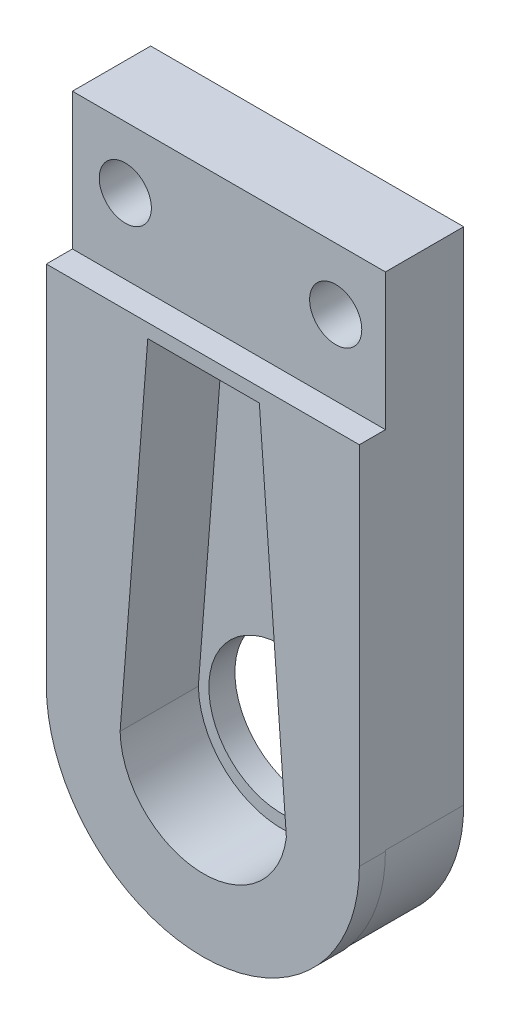
ISO-10303-21;
HEADER;
FILE_DESCRIPTION(('STEP AP214'),'2;1');
FILE_NAME('part.step','',(''),(''),'','','');
FILE_SCHEMA(('AUTOMOTIVE_DESIGN { 1 0 10303 214 1 1 1 1 }'));
ENDSEC;
DATA;
#1=APPLICATION_CONTEXT('core data for automotive mechanical design processes');
#2=APPLICATION_PROTOCOL_DEFINITION('international standard','automotive_design',2000,#1);
#3=PRODUCT_CONTEXT('',#1,'mechanical');
#4=PRODUCT('Part','Part','',(#3));
#5=PRODUCT_RELATED_PRODUCT_CATEGORY('part','',(#4));
#6=PRODUCT_DEFINITION_FORMATION('','',#4);
#7=PRODUCT_DEFINITION_CONTEXT('part definition',#1,'design');
#8=PRODUCT_DEFINITION('design','',#6,#7);
#9=PRODUCT_DEFINITION_SHAPE('','',#8);
#10=(LENGTH_UNIT() NAMED_UNIT(*) SI_UNIT(.MILLI.,.METRE.));
#11=(NAMED_UNIT(*) PLANE_ANGLE_UNIT() SI_UNIT($,.RADIAN.));
#12=(NAMED_UNIT(*) SI_UNIT($,.STERADIAN.) SOLID_ANGLE_UNIT());
#13=UNCERTAINTY_MEASURE_WITH_UNIT(LENGTH_MEASURE(1.E-05),#10,'distance_accuracy_value','');
#14=(GEOMETRIC_REPRESENTATION_CONTEXT(3) GLOBAL_UNCERTAINTY_ASSIGNED_CONTEXT((#13)) GLOBAL_UNIT_ASSIGNED_CONTEXT((#10,
#11,#12)) REPRESENTATION_CONTEXT('',''));
#15=CARTESIAN_POINT('',(0.,0.,0.));
#16=DIRECTION('',(0.,0.,1.));
#17=DIRECTION('',(1.,0.,0.));
#18=AXIS2_PLACEMENT_3D('',#15,#16,#17);
#19=CARTESIAN_POINT('',(-60.0277041312551,110.255662644268,8.));
#20=DIRECTION('',(1.,0.,0.));
#21=DIRECTION('',(0.,0.,-1.));
#22=AXIS2_PLACEMENT_3D('',#19,#20,#21);
#23=PLANE('',#22);
#24=DIRECTION('',(0.,-1.,0.));
#25=VECTOR('',#24,1.);
#26=CARTESIAN_POINT('',(-60.0277041312551,105.017998247306,8.));
#27=LINE('',#26,#25);
#28=CARTESIAN_POINT('',(-60.0277041312551,91.0556626442678,8.));
#29=VERTEX_POINT('',#28);
#30=CARTESIAN_POINT('',(-60.0277041312551,91.0179982473059,8.));
#31=VERTEX_POINT('',#30);
#32=EDGE_CURVE('E197',#29,#31,#27,.T.);
#33=ORIENTED_EDGE('',*,*,#32,.T.);
#34=DIRECTION('',(0.,0.,-1.));
#35=VECTOR('',#34,1.);
#36=CARTESIAN_POINT('',(-60.0277041312551,91.0179982473059,8.));
#37=LINE('',#36,#35);
#38=CARTESIAN_POINT('',(-60.0277041312551,91.0179982473059,9.));
#39=VERTEX_POINT('',#38);
#40=EDGE_CURVE('E281',#31,#39,#37,.F.);
#41=ORIENTED_EDGE('',*,*,#40,.T.);
#42=DIRECTION('',(0.,-1.,0.));
#43=VECTOR('',#42,1.);
#44=CARTESIAN_POINT('',(-60.0277041312551,105.017998247306,9.));
#45=LINE('',#44,#43);
#46=CARTESIAN_POINT('',(-60.0277041312551,105.017998247306,9.));
#47=VERTEX_POINT('',#46);
#48=EDGE_CURVE('E186',#47,#39,#45,.T.);
#49=ORIENTED_EDGE('',*,*,#48,.F.);
#50=DIRECTION('',(0.,0.,-1.));
#51=VECTOR('',#50,1.);
#52=CARTESIAN_POINT('',(-60.0277041312551,105.017998247306,9.));
#53=LINE('',#52,#51);
#54=CARTESIAN_POINT('',(-60.0277041312551,105.017998247306,8.));
#55=VERTEX_POINT('',#54);
#56=EDGE_CURVE('E196',#47,#55,#53,.T.);
#57=ORIENTED_EDGE('',*,*,#56,.T.);
#58=DIRECTION('',(0.,-1.,0.));
#59=VECTOR('',#58,1.);
#60=CARTESIAN_POINT('',(-60.0277041312551,110.255662644268,8.));
#61=LINE('',#60,#59);
#62=CARTESIAN_POINT('',(-60.0277041312551,110.255662644268,8.));
#63=VERTEX_POINT('',#62);
#64=EDGE_CURVE('E215',#63,#55,#61,.T.);
#65=ORIENTED_EDGE('',*,*,#64,.F.);
#66=DIRECTION('',(0.,0.,-1.));
#67=VECTOR('',#66,1.);
#68=CARTESIAN_POINT('',(-60.0277041312551,110.255662644268,8.));
#69=LINE('',#68,#67);
#70=CARTESIAN_POINT('',(-60.0277041312551,110.255662644268,5.));
#71=VERTEX_POINT('',#70);
#72=EDGE_CURVE('E225',#63,#71,#69,.T.);
#73=ORIENTED_EDGE('',*,*,#72,.T.);
#74=DIRECTION('',(0.,-1.,0.));
#75=VECTOR('',#74,1.);
#76=CARTESIAN_POINT('',(-60.0277041312551,110.255662644268,5.));
#77=LINE('',#76,#75);
#78=CARTESIAN_POINT('',(-60.0277041312551,91.0556626442678,5.));
#79=VERTEX_POINT('',#78);
#80=EDGE_CURVE('E226',#71,#79,#77,.T.);
#81=ORIENTED_EDGE('',*,*,#80,.T.);
#82=DIRECTION('',(0.,0.,-1.));
#83=VECTOR('',#82,1.);
#84=CARTESIAN_POINT('',(-60.0277041312551,91.0556626442678,8.));
#85=LINE('',#84,#83);
#86=EDGE_CURVE('E260',#79,#29,#85,.F.);
#87=ORIENTED_EDGE('',*,*,#86,.T.);
#88=EDGE_LOOP('',(#33,#41,#49,#57,#65,#73,#81,#87));
#89=FACE_BOUND('',#88,.T.);
#90=ADVANCED_FACE('F39',(#89),#23,.F.);
#91=CARTESIAN_POINT('',(-48.0277041312551,110.255662644268,8.));
#92=DIRECTION('',(-1.,0.,0.));
#93=DIRECTION('',(0.,0.,1.));
#94=AXIS2_PLACEMENT_3D('',#91,#92,#93);
#95=PLANE('',#94);
#96=DIRECTION('',(0.,1.,0.));
#97=VECTOR('',#96,1.);
#98=CARTESIAN_POINT('',(-48.0277041312551,105.017998247306,9.));
#99=LINE('',#98,#97);
#100=CARTESIAN_POINT('',(-48.0277041312551,91.0179982473059,9.));
#101=VERTEX_POINT('',#100);
#102=CARTESIAN_POINT('',(-48.0277041312551,105.017998247306,9.));
#103=VERTEX_POINT('',#102);
#104=EDGE_CURVE('E189',#101,#103,#99,.T.);
#105=ORIENTED_EDGE('',*,*,#104,.F.);
#106=DIRECTION('',(0.,0.,-1.));
#107=VECTOR('',#106,1.);
#108=CARTESIAN_POINT('',(-48.0277041312551,91.0179982473059,8.));
#109=LINE('',#108,#107);
#110=CARTESIAN_POINT('',(-48.0277041312551,91.0179982473059,8.));
#111=VERTEX_POINT('',#110);
#112=EDGE_CURVE('E263',#101,#111,#109,.T.);
#113=ORIENTED_EDGE('',*,*,#112,.T.);
#114=DIRECTION('',(0.,1.,0.));
#115=VECTOR('',#114,1.);
#116=CARTESIAN_POINT('',(-48.0277041312551,105.017998247306,8.));
#117=LINE('',#116,#115);
#118=CARTESIAN_POINT('',(-48.0277041312551,91.0556626442678,8.));
#119=VERTEX_POINT('',#118);
#120=EDGE_CURVE('E201',#111,#119,#117,.T.);
#121=ORIENTED_EDGE('',*,*,#120,.T.);
#122=DIRECTION('',(0.,0.,-1.));
#123=VECTOR('',#122,1.);
#124=CARTESIAN_POINT('',(-48.0277041312551,91.0556626442678,8.));
#125=LINE('',#124,#123);
#126=CARTESIAN_POINT('',(-48.0277041312551,91.0556626442678,5.));
#127=VERTEX_POINT('',#126);
#128=EDGE_CURVE('E242',#119,#127,#125,.T.);
#129=ORIENTED_EDGE('',*,*,#128,.T.);
#130=DIRECTION('',(0.,1.,0.));
#131=VECTOR('',#130,1.);
#132=CARTESIAN_POINT('',(-48.0277041312551,110.255662644268,5.));
#133=LINE('',#132,#131);
#134=CARTESIAN_POINT('',(-48.0277041312551,110.255662644268,5.));
#135=VERTEX_POINT('',#134);
#136=EDGE_CURVE('E230',#127,#135,#133,.T.);
#137=ORIENTED_EDGE('',*,*,#136,.T.);
#138=DIRECTION('',(0.,0.,-1.));
#139=VECTOR('',#138,1.);
#140=CARTESIAN_POINT('',(-48.0277041312551,110.255662644268,8.));
#141=LINE('',#140,#139);
#142=CARTESIAN_POINT('',(-48.0277041312551,110.255662644268,8.));
#143=VERTEX_POINT('',#142);
#144=EDGE_CURVE('E238',#143,#135,#141,.T.);
#145=ORIENTED_EDGE('',*,*,#144,.F.);
#146=DIRECTION('',(0.,1.,0.));
#147=VECTOR('',#146,1.);
#148=CARTESIAN_POINT('',(-48.0277041312551,110.255662644268,8.));
#149=LINE('',#148,#147);
#150=CARTESIAN_POINT('',(-48.0277041312551,105.017998247306,8.));
#151=VERTEX_POINT('',#150);
#152=EDGE_CURVE('E218',#151,#143,#149,.T.);
#153=ORIENTED_EDGE('',*,*,#152,.F.);
#154=DIRECTION('',(0.,0.,-1.));
#155=VECTOR('',#154,1.);
#156=CARTESIAN_POINT('',(-48.0277041312551,105.017998247306,9.));
#157=LINE('',#156,#155);
#158=EDGE_CURVE('E210',#103,#151,#157,.T.);
#159=ORIENTED_EDGE('',*,*,#158,.F.);
#160=EDGE_LOOP('',(#105,#113,#121,#129,#137,#145,#153,#159));
#161=FACE_BOUND('',#160,.T.);
#162=ADVANCED_FACE('F310',(#161),#95,.F.);
#163=CARTESIAN_POINT('',(-60.0277041312551,110.255662644268,8.));
#164=DIRECTION('',(0.,-1.,0.));
#165=DIRECTION('',(0.,0.,-1.));
#166=AXIS2_PLACEMENT_3D('',#163,#164,#165);
#167=PLANE('',#166);
#168=DIRECTION('',(-1.,0.,0.));
#169=VECTOR('',#168,1.);
#170=CARTESIAN_POINT('',(-60.0277041312551,110.255662644268,5.));
#171=LINE('',#170,#169);
#172=EDGE_CURVE('E219',#135,#71,#171,.T.);
#173=ORIENTED_EDGE('',*,*,#172,.T.);
#174=ORIENTED_EDGE('',*,*,#72,.F.);
#175=DIRECTION('',(-1.,0.,0.));
#176=VECTOR('',#175,1.);
#177=CARTESIAN_POINT('',(-60.0277041312551,110.255662644268,8.));
#178=LINE('',#177,#176);
#179=EDGE_CURVE('E222',#143,#63,#178,.T.);
#180=ORIENTED_EDGE('',*,*,#179,.F.);
#181=ORIENTED_EDGE('',*,*,#144,.T.);
#182=EDGE_LOOP('',(#173,#174,#180,#181));
#183=FACE_BOUND('',#182,.T.);
#184=ADVANCED_FACE('F316',(#183),#167,.F.);
#185=CARTESIAN_POINT('',(0.,0.,8.));
#186=DIRECTION('',(0.,0.,1.));
#187=DIRECTION('',(1.,0.,0.));
#188=AXIS2_PLACEMENT_3D('',#185,#186,#187);
#189=PLANE('',#188);
#190=CARTESIAN_POINT('',(-57.9998852467417,107.886757067728,8.));
#191=DIRECTION('',(0.,0.,1.));
#192=DIRECTION('',(1.,0.,0.));
#193=AXIS2_PLACEMENT_3D('',#190,#191,#192);
#194=CIRCLE('',#193,1.00000000000001);
#195=CARTESIAN_POINT('',(-56.9998852467417,107.886757067728,8.));
#196=VERTEX_POINT('',#195);
#197=EDGE_CURVE('E472',#196,#196,#194,.T.);
#198=ORIENTED_EDGE('',*,*,#197,.F.);
#199=EDGE_LOOP('',(#198));
#200=FACE_BOUND('',#199,.T.);
#201=CARTESIAN_POINT('',(-49.9341185232434,107.886757067728,8.));
#202=DIRECTION('',(0.,0.,1.));
#203=DIRECTION('',(1.,0.,0.));
#204=AXIS2_PLACEMENT_3D('',#201,#202,#203);
#205=CIRCLE('',#204,1.00000000000001);
#206=CARTESIAN_POINT('',(-48.9341185232434,107.886757067728,8.));
#207=VERTEX_POINT('',#206);
#208=EDGE_CURVE('E480',#207,#207,#205,.T.);
#209=ORIENTED_EDGE('',*,*,#208,.F.);
#210=EDGE_LOOP('',(#209));
#211=FACE_BOUND('',#210,.T.);
#212=DIRECTION('',(-1.,0.,0.));
#213=VECTOR('',#212,1.);
#214=CARTESIAN_POINT('',(-60.0277041312551,105.017998247306,8.));
#215=LINE('',#214,#213);
#216=EDGE_CURVE('E190',#151,#55,#215,.T.);
#217=ORIENTED_EDGE('',*,*,#216,.F.);
#218=ORIENTED_EDGE('',*,*,#152,.T.);
#219=ORIENTED_EDGE('',*,*,#179,.T.);
#220=ORIENTED_EDGE('',*,*,#64,.T.);
#221=EDGE_LOOP('',(#217,#218,#219,#220));
#222=FACE_BOUND('',#221,.T.);
#223=ADVANCED_FACE('F369',(#200,#211,#222),#189,.T.);
#224=CARTESIAN_POINT('',(0.,0.,5.));
#225=DIRECTION('',(0.,0.,1.));
#226=DIRECTION('',(1.,0.,0.));
#227=AXIS2_PLACEMENT_3D('',#224,#225,#226);
#228=PLANE('',#227);
#229=CARTESIAN_POINT('',(-57.9998852467417,107.886757067728,5.));
#230=DIRECTION('',(0.,0.,1.));
#231=DIRECTION('',(1.,0.,0.));
#232=AXIS2_PLACEMENT_3D('',#229,#230,#231);
#233=CIRCLE('',#232,1.00000000000001);
#234=CARTESIAN_POINT('',(-56.9998852467417,107.886757067728,5.));
#235=VERTEX_POINT('',#234);
#236=EDGE_CURVE('E470',#235,#235,#233,.T.);
#237=ORIENTED_EDGE('',*,*,#236,.T.);
#238=EDGE_LOOP('',(#237));
#239=FACE_BOUND('',#238,.T.);
#240=CARTESIAN_POINT('',(-49.9341185232434,107.886757067728,5.));
#241=DIRECTION('',(0.,0.,1.));
#242=DIRECTION('',(1.,0.,0.));
#243=AXIS2_PLACEMENT_3D('',#240,#241,#242);
#244=CIRCLE('',#243,1.00000000000001);
#245=CARTESIAN_POINT('',(-48.9341185232434,107.886757067728,5.));
#246=VERTEX_POINT('',#245);
#247=EDGE_CURVE('E474',#246,#246,#244,.T.);
#248=ORIENTED_EDGE('',*,*,#247,.T.);
#249=EDGE_LOOP('',(#248));
#250=FACE_BOUND('',#249,.T.);
#251=CARTESIAN_POINT('',(-53.9974483250001,91.0820319097262,5.));
#252=DIRECTION('',(0.,0.,1.));
#253=DIRECTION('',(1.,0.,0.));
#254=AXIS2_PLACEMENT_3D('',#251,#252,#253);
#255=CIRCLE('',#254,2.8);
#256=CARTESIAN_POINT('',(-51.1974483250001,91.0820319097262,5.));
#257=VERTEX_POINT('',#256);
#258=EDGE_CURVE('E164',#257,#257,#255,.T.);
#259=ORIENTED_EDGE('',*,*,#258,.T.);
#260=EDGE_LOOP('',(#259));
#261=FACE_BOUND('',#260,.T.);
#262=ORIENTED_EDGE('',*,*,#136,.F.);
#263=CARTESIAN_POINT('',(-54.0277041312551,91.0556626442678,5.));
#264=DIRECTION('',(0.,0.,1.));
#265=DIRECTION('',(1.,0.,0.));
#266=AXIS2_PLACEMENT_3D('',#263,#264,#265);
#267=CIRCLE('',#266,6.);
#268=CARTESIAN_POINT('',(-54.0277041312551,85.0556626442678,5.));
#269=VERTEX_POINT('',#268);
#270=EDGE_CURVE('E249',#127,#269,#267,.F.);
#271=ORIENTED_EDGE('',*,*,#270,.T.);
#272=CARTESIAN_POINT('',(-54.0277041312551,91.0556626442678,5.));
#273=DIRECTION('',(0.,0.,1.));
#274=DIRECTION('',(1.,0.,0.));
#275=AXIS2_PLACEMENT_3D('',#272,#273,#274);
#276=CIRCLE('',#275,6.);
#277=EDGE_CURVE('E246',#269,#79,#276,.F.);
#278=ORIENTED_EDGE('',*,*,#277,.T.);
#279=ORIENTED_EDGE('',*,*,#80,.F.);
#280=ORIENTED_EDGE('',*,*,#172,.F.);
#281=EDGE_LOOP('',(#262,#271,#278,#279,#280));
#282=FACE_BOUND('',#281,.T.);
#283=ADVANCED_FACE('F328',(#239,#250,#261,#282),#228,.F.);
#284=CARTESIAN_POINT('',(-54.0277041312551,91.0556626442678,8.));
#285=DIRECTION('',(0.,0.,-1.));
#286=DIRECTION('',(-1.,0.,0.));
#287=AXIS2_PLACEMENT_3D('',#284,#285,#286);
#288=CYLINDRICAL_SURFACE('',#287,6.);
#289=DIRECTION('',(0.,0.,-1.));
#290=VECTOR('',#289,1.);
#291=CARTESIAN_POINT('',(-54.0277041312551,85.0556626442678,8.));
#292=LINE('',#291,#290);
#293=CARTESIAN_POINT('',(-54.0277041312551,85.0556626442678,8.));
#294=VERTEX_POINT('',#293);
#295=EDGE_CURVE('E214',#294,#269,#292,.T.);
#296=ORIENTED_EDGE('',*,*,#295,.F.);
#297=CARTESIAN_POINT('',(-54.0277041312551,91.0556626442678,8.));
#298=DIRECTION('',(0.,0.,1.));
#299=DIRECTION('',(1.,0.,0.));
#300=AXIS2_PLACEMENT_3D('',#297,#298,#299);
#301=CIRCLE('',#300,6.);
#302=EDGE_CURVE('E252',#29,#294,#301,.T.);
#303=ORIENTED_EDGE('',*,*,#302,.F.);
#304=ORIENTED_EDGE('',*,*,#86,.F.);
#305=ORIENTED_EDGE('',*,*,#277,.F.);
#306=EDGE_LOOP('',(#296,#303,#304,#305));
#307=FACE_BOUND('',#306,.T.);
#308=ADVANCED_FACE('F325',(#307),#288,.T.);
#309=CARTESIAN_POINT('',(-54.0277041312551,91.0556626442678,8.));
#310=DIRECTION('',(0.,0.,-1.));
#311=DIRECTION('',(-1.,0.,0.));
#312=AXIS2_PLACEMENT_3D('',#309,#310,#311);
#313=CYLINDRICAL_SURFACE('',#312,6.);
#314=CARTESIAN_POINT('',(-54.0277041312551,91.0556626442678,8.));
#315=DIRECTION('',(0.,0.,1.));
#316=DIRECTION('',(1.,0.,0.));
#317=AXIS2_PLACEMENT_3D('',#314,#315,#316);
#318=CIRCLE('',#317,6.);
#319=EDGE_CURVE('E256',#294,#119,#318,.T.);
#320=ORIENTED_EDGE('',*,*,#319,.F.);
#321=ORIENTED_EDGE('',*,*,#295,.T.);
#322=ORIENTED_EDGE('',*,*,#270,.F.);
#323=ORIENTED_EDGE('',*,*,#128,.F.);
#324=EDGE_LOOP('',(#320,#321,#322,#323));
#325=FACE_BOUND('',#324,.T.);
#326=ADVANCED_FACE('F321',(#325),#313,.T.);
#327=CARTESIAN_POINT('',(0.,0.,8.));
#328=DIRECTION('',(0.,0.,1.));
#329=DIRECTION('',(1.,0.,0.));
#330=AXIS2_PLACEMENT_3D('',#327,#328,#329);
#331=PLANE('',#330);
#332=ORIENTED_EDGE('',*,*,#120,.F.);
#333=CARTESIAN_POINT('',(-54.0277041312551,91.0179982473059,8.));
#334=DIRECTION('',(0.,0.,1.));
#335=DIRECTION('',(1.,0.,0.));
#336=AXIS2_PLACEMENT_3D('',#333,#334,#335);
#337=CIRCLE('',#336,6.);
#338=CARTESIAN_POINT('',(-54.0277041312551,85.0179982473059,8.));
#339=VERTEX_POINT('',#338);
#340=EDGE_CURVE('E273',#111,#339,#337,.F.);
#341=ORIENTED_EDGE('',*,*,#340,.T.);
#342=CARTESIAN_POINT('',(-54.0277041312551,91.0179982473059,8.));
#343=DIRECTION('',(0.,0.,1.));
#344=DIRECTION('',(1.,0.,0.));
#345=AXIS2_PLACEMENT_3D('',#342,#343,#344);
#346=CIRCLE('',#345,6.);
#347=EDGE_CURVE('E270',#339,#31,#346,.F.);
#348=ORIENTED_EDGE('',*,*,#347,.T.);
#349=ORIENTED_EDGE('',*,*,#32,.F.);
#350=ORIENTED_EDGE('',*,*,#302,.T.);
#351=ORIENTED_EDGE('',*,*,#319,.T.);
#352=EDGE_LOOP('',(#332,#341,#348,#349,#350,#351));
#353=FACE_BOUND('',#352,.T.);
#354=ADVANCED_FACE('F324',(#353),#331,.F.);
#355=CARTESIAN_POINT('',(-60.0277041312551,105.017998247306,9.));
#356=DIRECTION('',(0.,-1.,0.));
#357=DIRECTION('',(0.,0.,-1.));
#358=AXIS2_PLACEMENT_3D('',#355,#356,#357);
#359=PLANE('',#358);
#360=ORIENTED_EDGE('',*,*,#216,.T.);
#361=ORIENTED_EDGE('',*,*,#56,.F.);
#362=DIRECTION('',(-1.,0.,0.));
#363=VECTOR('',#362,1.);
#364=CARTESIAN_POINT('',(-60.0277041312551,105.017998247306,9.));
#365=LINE('',#364,#363);
#366=EDGE_CURVE('E193',#103,#47,#365,.T.);
#367=ORIENTED_EDGE('',*,*,#366,.F.);
#368=ORIENTED_EDGE('',*,*,#158,.T.);
#369=EDGE_LOOP('',(#360,#361,#367,#368));
#370=FACE_BOUND('',#369,.T.);
#371=ADVANCED_FACE('F349',(#370),#359,.F.);
#372=CARTESIAN_POINT('',(0.,0.,9.));
#373=DIRECTION('',(0.,0.,1.));
#374=DIRECTION('',(1.,0.,0.));
#375=AXIS2_PLACEMENT_3D('',#372,#373,#374);
#376=PLANE('',#375);
#377=DIRECTION('',(-0.0779290647362784,-0.996958906309247,0.));
#378=VECTOR('',#377,1.);
#379=CARTESIAN_POINT('',(-63.9152334498447,4.99604781463508,9.));
#380=LINE('',#379,#378);
#381=CARTESIAN_POINT('',(-56.1384239196777,104.48600769043,9.));
#382=VERTEX_POINT('',#381);
#383=CARTESIAN_POINT('',(-57.1992263793945,90.9149932861328,9.));
#384=VERTEX_POINT('',#383);
#385=EDGE_CURVE('E11',#382,#384,#380,.T.);
#386=ORIENTED_EDGE('',*,*,#385,.F.);
#387=DIRECTION('',(-1.,0.,0.));
#388=VECTOR('',#387,1.);
#389=CARTESIAN_POINT('',(0.,104.48600769043,9.));
#390=LINE('',#389,#388);
#391=CARTESIAN_POINT('',(-51.8615760803223,104.48600769043,9.));
#392=VERTEX_POINT('',#391);
#393=EDGE_CURVE('E48',#392,#382,#390,.T.);
#394=ORIENTED_EDGE('',*,*,#393,.F.);
#395=DIRECTION('',(-0.0743796784784657,0.997229995251567,0.));
#396=VECTOR('',#395,1.);
#397=CARTESIAN_POINT('',(-43.824552196528,-3.26871044529521,9.));
#398=LINE('',#397,#396);
#399=CARTESIAN_POINT('',(-50.8248977661133,90.5869598388672,9.));
#400=VERTEX_POINT('',#399);
#401=EDGE_CURVE('E290',#400,#392,#398,.T.);
#402=ORIENTED_EDGE('',*,*,#401,.F.);
#403=CARTESIAN_POINT('',(-54.0000006238961,90.985353999353,9.));
#404=DIRECTION('',(0.,0.,1.));
#405=DIRECTION('',(1.,0.,0.));
#406=AXIS2_PLACEMENT_3D('',#403,#404,#405);
#407=CIRCLE('',#406,3.19999938509519);
#408=EDGE_CURVE('E284',#384,#400,#407,.T.);
#409=ORIENTED_EDGE('',*,*,#408,.F.);
#410=EDGE_LOOP('',(#386,#394,#402,#409));
#411=FACE_BOUND('',#410,.T.);
#412=CARTESIAN_POINT('',(-54.0277041312551,91.0179982473059,9.));
#413=DIRECTION('',(0.,0.,1.));
#414=DIRECTION('',(1.,0.,0.));
#415=AXIS2_PLACEMENT_3D('',#412,#413,#414);
#416=CIRCLE('',#415,6.);
#417=CARTESIAN_POINT('',(-54.0277041312551,85.0179982473059,9.));
#418=VERTEX_POINT('',#417);
#419=EDGE_CURVE('E62',#39,#418,#416,.T.);
#420=ORIENTED_EDGE('',*,*,#419,.T.);
#421=CARTESIAN_POINT('',(-54.0277041312551,91.0179982473059,9.));
#422=DIRECTION('',(0.,0.,1.));
#423=DIRECTION('',(1.,0.,0.));
#424=AXIS2_PLACEMENT_3D('',#421,#422,#423);
#425=CIRCLE('',#424,6.);
#426=EDGE_CURVE('E278',#418,#101,#425,.T.);
#427=ORIENTED_EDGE('',*,*,#426,.T.);
#428=ORIENTED_EDGE('',*,*,#104,.T.);
#429=ORIENTED_EDGE('',*,*,#366,.T.);
#430=ORIENTED_EDGE('',*,*,#48,.T.);
#431=EDGE_LOOP('',(#420,#427,#428,#429,#430));
#432=FACE_BOUND('',#431,.T.);
#433=ADVANCED_FACE('F298',(#411,#432),#376,.T.);
#434=CARTESIAN_POINT('',(-54.0277041312551,91.0179982473059,9.));
#435=DIRECTION('',(0.,0.,-1.));
#436=DIRECTION('',(-1.,0.,0.));
#437=AXIS2_PLACEMENT_3D('',#434,#435,#436);
#438=CYLINDRICAL_SURFACE('',#437,6.);
#439=DIRECTION('',(0.,0.,-1.));
#440=VECTOR('',#439,1.);
#441=CARTESIAN_POINT('',(-54.0277041312551,85.0179982473059,9.));
#442=LINE('',#441,#440);
#443=EDGE_CURVE('E179',#418,#339,#442,.T.);
#444=ORIENTED_EDGE('',*,*,#443,.F.);
#445=ORIENTED_EDGE('',*,*,#419,.F.);
#446=ORIENTED_EDGE('',*,*,#40,.F.);
#447=ORIENTED_EDGE('',*,*,#347,.F.);
#448=EDGE_LOOP('',(#444,#445,#446,#447));
#449=FACE_BOUND('',#448,.T.);
#450=ADVANCED_FACE('F41',(#449),#438,.T.);
#451=CARTESIAN_POINT('',(-54.0277041312551,91.0179982473059,8.));
#452=DIRECTION('',(0.,0.,-1.));
#453=DIRECTION('',(-1.,0.,0.));
#454=AXIS2_PLACEMENT_3D('',#451,#452,#453);
#455=CYLINDRICAL_SURFACE('',#454,6.);
#456=ORIENTED_EDGE('',*,*,#426,.F.);
#457=ORIENTED_EDGE('',*,*,#443,.T.);
#458=ORIENTED_EDGE('',*,*,#340,.F.);
#459=ORIENTED_EDGE('',*,*,#112,.F.);
#460=EDGE_LOOP('',(#456,#457,#458,#459));
#461=FACE_BOUND('',#460,.T.);
#462=ADVANCED_FACE('F330',(#461),#455,.T.);
#463=CARTESIAN_POINT('',(-56.1384239196777,104.48600769043,6.));
#464=DIRECTION('',(-0.996958906309246,0.0779290647362784,0.));
#465=DIRECTION('',(-0.0779290647362784,-0.996958906309247,0.));
#466=AXIS2_PLACEMENT_3D('',#463,#464,#465);
#467=PLANE('',#466);
#468=ORIENTED_EDGE('',*,*,#385,.T.);
#469=DIRECTION('',(0.,0.,1.));
#470=VECTOR('',#469,1.);
#471=CARTESIAN_POINT('',(-57.1992263793945,90.9149932861328,6.));
#472=LINE('',#471,#470);
#473=CARTESIAN_POINT('',(-57.1992263793945,90.9149932861328,6.));
#474=VERTEX_POINT('',#473);
#475=EDGE_CURVE('E55',#474,#384,#472,.T.);
#476=ORIENTED_EDGE('',*,*,#475,.F.);
#477=DIRECTION('',(-0.0779290647362784,-0.996958906309247,0.));
#478=VECTOR('',#477,1.);
#479=CARTESIAN_POINT('',(-56.1384239196777,104.48600769043,6.));
#480=LINE('',#479,#478);
#481=CARTESIAN_POINT('',(-56.1384239196777,104.48600769043,6.));
#482=VERTEX_POINT('',#481);
#483=EDGE_CURVE('E143',#482,#474,#480,.T.);
#484=ORIENTED_EDGE('',*,*,#483,.F.);
#485=DIRECTION('',(0.,0.,1.));
#486=VECTOR('',#485,1.);
#487=CARTESIAN_POINT('',(-56.1384239196777,104.48600769043,6.));
#488=LINE('',#487,#486);
#489=EDGE_CURVE('E176',#482,#382,#488,.T.);
#490=ORIENTED_EDGE('',*,*,#489,.T.);
#491=EDGE_LOOP('',(#468,#476,#484,#490));
#492=FACE_BOUND('',#491,.T.);
#493=ADVANCED_FACE('F140',(#492),#467,.F.);
#494=CARTESIAN_POINT('',(-56.1384239196777,104.48600769043,6.));
#495=DIRECTION('',(0.,1.,0.));
#496=DIRECTION('',(0.,0.,1.));
#497=AXIS2_PLACEMENT_3D('',#494,#495,#496);
#498=PLANE('',#497);
#499=ORIENTED_EDGE('',*,*,#393,.T.);
#500=ORIENTED_EDGE('',*,*,#489,.F.);
#501=DIRECTION('',(-1.,0.,0.));
#502=VECTOR('',#501,1.);
#503=CARTESIAN_POINT('',(-56.1384239196777,104.48600769043,6.));
#504=LINE('',#503,#502);
#505=CARTESIAN_POINT('',(-51.8615760803223,104.48600769043,6.));
#506=VERTEX_POINT('',#505);
#507=EDGE_CURVE('E149',#506,#482,#504,.T.);
#508=ORIENTED_EDGE('',*,*,#507,.F.);
#509=DIRECTION('',(0.,0.,1.));
#510=VECTOR('',#509,1.);
#511=CARTESIAN_POINT('',(-51.8615760803223,104.48600769043,6.));
#512=LINE('',#511,#510);
#513=EDGE_CURVE('E180',#506,#392,#512,.T.);
#514=ORIENTED_EDGE('',*,*,#513,.T.);
#515=EDGE_LOOP('',(#499,#500,#508,#514));
#516=FACE_BOUND('',#515,.T.);
#517=ADVANCED_FACE('F295',(#516),#498,.F.);
#518=CARTESIAN_POINT('',(-51.8615760803223,104.48600769043,6.));
#519=DIRECTION('',(0.997229995251567,0.0743796784784657,0.));
#520=DIRECTION('',(-0.0743796784784657,0.997229995251567,0.));
#521=AXIS2_PLACEMENT_3D('',#518,#519,#520);
#522=PLANE('',#521);
#523=ORIENTED_EDGE('',*,*,#401,.T.);
#524=ORIENTED_EDGE('',*,*,#513,.F.);
#525=DIRECTION('',(-0.0743796784784657,0.997229995251567,0.));
#526=VECTOR('',#525,1.);
#527=CARTESIAN_POINT('',(-51.8615760803223,104.48600769043,6.));
#528=LINE('',#527,#526);
#529=CARTESIAN_POINT('',(-50.8248977661133,90.5869598388672,6.));
#530=VERTEX_POINT('',#529);
#531=EDGE_CURVE('E159',#530,#506,#528,.T.);
#532=ORIENTED_EDGE('',*,*,#531,.F.);
#533=DIRECTION('',(0.,0.,1.));
#534=VECTOR('',#533,1.);
#535=CARTESIAN_POINT('',(-50.8248977661133,90.5869598388672,6.));
#536=LINE('',#535,#534);
#537=EDGE_CURVE('E148',#530,#400,#536,.T.);
#538=ORIENTED_EDGE('',*,*,#537,.T.);
#539=EDGE_LOOP('',(#523,#524,#532,#538));
#540=FACE_BOUND('',#539,.T.);
#541=ADVANCED_FACE('F300',(#540),#522,.F.);
#542=CARTESIAN_POINT('',(-54.0000006238961,90.985353999353,6.));
#543=DIRECTION('',(0.,0.,1.));
#544=DIRECTION('',(1.,0.,0.));
#545=AXIS2_PLACEMENT_3D('',#542,#543,#544);
#546=CYLINDRICAL_SURFACE('',#545,3.19999938509519);
#547=ORIENTED_EDGE('',*,*,#408,.T.);
#548=ORIENTED_EDGE('',*,*,#537,.F.);
#549=CARTESIAN_POINT('',(-54.0000006238961,90.985353999353,6.));
#550=DIRECTION('',(0.,0.,1.));
#551=DIRECTION('',(1.,0.,0.));
#552=AXIS2_PLACEMENT_3D('',#549,#550,#551);
#553=CIRCLE('',#552,3.19999938509519);
#554=EDGE_CURVE('E152',#474,#530,#553,.T.);
#555=ORIENTED_EDGE('',*,*,#554,.F.);
#556=ORIENTED_EDGE('',*,*,#475,.T.);
#557=EDGE_LOOP('',(#547,#548,#555,#556));
#558=FACE_BOUND('',#557,.T.);
#559=ADVANCED_FACE('F153',(#558),#546,.F.);
#560=CARTESIAN_POINT('',(-54.0000006238961,90.985353999353,6.));
#561=DIRECTION('',(0.,0.,1.));
#562=DIRECTION('',(1.,0.,0.));
#563=AXIS2_PLACEMENT_3D('',#560,#561,#562);
#564=PLANE('',#563);
#565=CARTESIAN_POINT('',(-53.9974483250001,91.0820319097262,6.));
#566=DIRECTION('',(0.,0.,1.));
#567=DIRECTION('',(1.,0.,0.));
#568=AXIS2_PLACEMENT_3D('',#565,#566,#567);
#569=CIRCLE('',#568,2.8);
#570=CARTESIAN_POINT('',(-51.1974483250001,91.0820319097262,6.));
#571=VERTEX_POINT('',#570);
#572=EDGE_CURVE('E168',#571,#571,#569,.T.);
#573=ORIENTED_EDGE('',*,*,#572,.F.);
#574=EDGE_LOOP('',(#573));
#575=FACE_BOUND('',#574,.T.);
#576=ORIENTED_EDGE('',*,*,#483,.T.);
#577=ORIENTED_EDGE('',*,*,#554,.T.);
#578=ORIENTED_EDGE('',*,*,#531,.T.);
#579=ORIENTED_EDGE('',*,*,#507,.T.);
#580=EDGE_LOOP('',(#576,#577,#578,#579));
#581=FACE_BOUND('',#580,.T.);
#582=ADVANCED_FACE('F161',(#575,#581),#564,.T.);
#583=CARTESIAN_POINT('',(-53.9974483250001,91.0820319097262,5.));
#584=DIRECTION('',(0.,0.,1.));
#585=DIRECTION('',(1.,0.,0.));
#586=AXIS2_PLACEMENT_3D('',#583,#584,#585);
#587=CYLINDRICAL_SURFACE('',#586,2.8);
#588=ORIENTED_EDGE('',*,*,#258,.F.);
#589=EDGE_LOOP('',(#588));
#590=FACE_BOUND('',#589,.T.);
#591=ORIENTED_EDGE('',*,*,#572,.T.);
#592=EDGE_LOOP('',(#591));
#593=FACE_BOUND('',#592,.T.);
#594=ADVANCED_FACE('F432',(#590,#593),#587,.F.);
#595=CARTESIAN_POINT('',(-49.9341185232434,107.886757067728,5.));
#596=DIRECTION('',(0.,0.,1.));
#597=DIRECTION('',(1.,0.,0.));
#598=AXIS2_PLACEMENT_3D('',#595,#596,#597);
#599=CYLINDRICAL_SURFACE('',#598,1.00000000000001);
#600=ORIENTED_EDGE('',*,*,#247,.F.);
#601=EDGE_LOOP('',(#600));
#602=FACE_BOUND('',#601,.T.);
#603=ORIENTED_EDGE('',*,*,#208,.T.);
#604=EDGE_LOOP('',(#603));
#605=FACE_BOUND('',#604,.T.);
#606=ADVANCED_FACE('F441',(#602,#605),#599,.F.);
#607=CARTESIAN_POINT('',(-57.9998852467417,107.886757067728,5.));
#608=DIRECTION('',(0.,0.,1.));
#609=DIRECTION('',(1.,0.,0.));
#610=AXIS2_PLACEMENT_3D('',#607,#608,#609);
#611=CYLINDRICAL_SURFACE('',#610,1.00000000000001);
#612=ORIENTED_EDGE('',*,*,#236,.F.);
#613=EDGE_LOOP('',(#612));
#614=FACE_BOUND('',#613,.T.);
#615=ORIENTED_EDGE('',*,*,#197,.T.);
#616=EDGE_LOOP('',(#615));
#617=FACE_BOUND('',#616,.T.);
#618=ADVANCED_FACE('F450',(#614,#617),#611,.F.);
#619=CLOSED_SHELL('',(#90,#162,#184,#223,#283,#308,#326,#354,#371,#433,#450,#462,#493,#517,#541,
#559,#582,#594,#606,#618));
#620=MANIFOLD_SOLID_BREP('B2',#619);
#621=ADVANCED_BREP_SHAPE_REPRESENTATION('',(#18,#620),#14);
#622=SHAPE_DEFINITION_REPRESENTATION(#9,#621);
ENDSEC;
END-ISO-10303-21;
